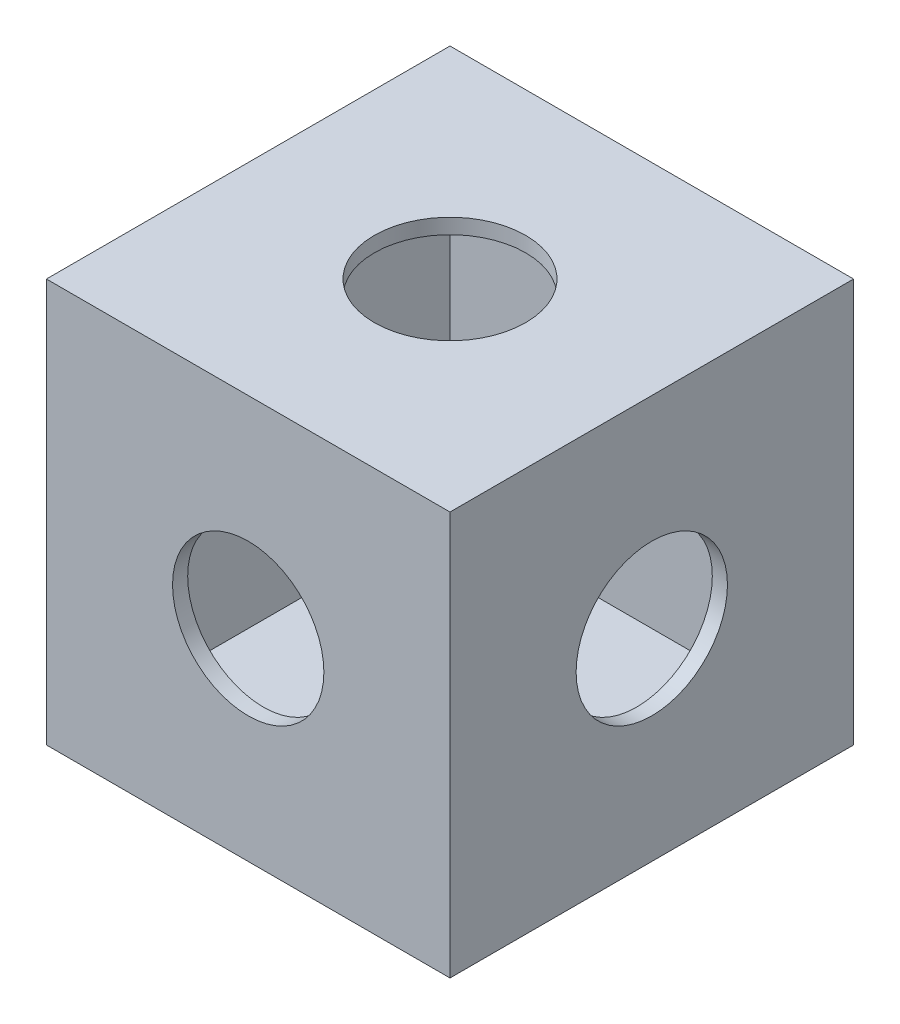
ISO-10303-21;
HEADER;
FILE_DESCRIPTION(('STEP AP214'),'2;1');
FILE_NAME('part.step','',(''),(''),'','','');
FILE_SCHEMA(('AUTOMOTIVE_DESIGN { 1 0 10303 214 1 1 1 1 }'));
ENDSEC;
DATA;
#1=APPLICATION_CONTEXT('core data for automotive mechanical design processes');
#2=APPLICATION_PROTOCOL_DEFINITION('international standard','automotive_design',2000,#1);
#3=PRODUCT_CONTEXT('',#1,'mechanical');
#4=PRODUCT('Part','Part','',(#3));
#5=PRODUCT_RELATED_PRODUCT_CATEGORY('part','',(#4));
#6=PRODUCT_DEFINITION_FORMATION('','',#4);
#7=PRODUCT_DEFINITION_CONTEXT('part definition',#1,'design');
#8=PRODUCT_DEFINITION('design','',#6,#7);
#9=PRODUCT_DEFINITION_SHAPE('','',#8);
#10=(LENGTH_UNIT() NAMED_UNIT(*) SI_UNIT(.MILLI.,.METRE.));
#11=(NAMED_UNIT(*) PLANE_ANGLE_UNIT() SI_UNIT($,.RADIAN.));
#12=(NAMED_UNIT(*) SI_UNIT($,.STERADIAN.) SOLID_ANGLE_UNIT());
#13=UNCERTAINTY_MEASURE_WITH_UNIT(LENGTH_MEASURE(1.E-05),#10,'distance_accuracy_value','');
#14=(GEOMETRIC_REPRESENTATION_CONTEXT(3) GLOBAL_UNCERTAINTY_ASSIGNED_CONTEXT((#13)) GLOBAL_UNIT_ASSIGNED_CONTEXT((#10,
#11,#12)) REPRESENTATION_CONTEXT('',''));
#15=CARTESIAN_POINT('',(0.,0.,0.));
#16=DIRECTION('',(0.,0.,1.));
#17=DIRECTION('',(1.,0.,0.));
#18=AXIS2_PLACEMENT_3D('',#15,#16,#17);
#19=CARTESIAN_POINT('',(0.,0.,0.));
#20=DIRECTION('',(0.,-1.,0.));
#21=DIRECTION('',(0.,0.,-1.));
#22=AXIS2_PLACEMENT_3D('',#19,#20,#21);
#23=PLANE('',#22);
#24=CARTESIAN_POINT('',(20.,0.,-20.));
#25=DIRECTION('',(0.,-1.,0.));
#26=DIRECTION('',(0.,0.,-1.));
#27=AXIS2_PLACEMENT_3D('',#24,#25,#26);
#28=CIRCLE('',#27,7.5);
#29=CARTESIAN_POINT('',(20.,0.,-27.5));
#30=VERTEX_POINT('',#29);
#31=EDGE_CURVE('E120',#30,#30,#28,.T.);
#32=ORIENTED_EDGE('',*,*,#31,.T.);
#33=EDGE_LOOP('',(#32));
#34=FACE_BOUND('',#33,.T.);
#35=DIRECTION('',(-1.,0.,0.));
#36=VECTOR('',#35,1.);
#37=CARTESIAN_POINT('',(1.5,0.,-38.5));
#38=LINE('',#37,#36);
#39=CARTESIAN_POINT('',(38.5,0.,-38.5));
#40=VERTEX_POINT('',#39);
#41=CARTESIAN_POINT('',(1.5,0.,-38.5));
#42=VERTEX_POINT('',#41);
#43=EDGE_CURVE('E133',#40,#42,#38,.T.);
#44=ORIENTED_EDGE('',*,*,#43,.T.);
#45=DIRECTION('',(0.,0.,1.));
#46=VECTOR('',#45,1.);
#47=CARTESIAN_POINT('',(1.5,0.,-1.5));
#48=LINE('',#47,#46);
#49=CARTESIAN_POINT('',(1.5,0.,-1.5));
#50=VERTEX_POINT('',#49);
#51=EDGE_CURVE('E128',#42,#50,#48,.T.);
#52=ORIENTED_EDGE('',*,*,#51,.T.);
#53=DIRECTION('',(1.,0.,0.));
#54=VECTOR('',#53,1.);
#55=CARTESIAN_POINT('',(1.5,0.,-1.5));
#56=LINE('',#55,#54);
#57=CARTESIAN_POINT('',(38.5,0.,-1.5));
#58=VERTEX_POINT('',#57);
#59=EDGE_CURVE('E143',#50,#58,#56,.T.);
#60=ORIENTED_EDGE('',*,*,#59,.T.);
#61=DIRECTION('',(0.,0.,-1.));
#62=VECTOR('',#61,1.);
#63=CARTESIAN_POINT('',(38.5,0.,-1.5));
#64=LINE('',#63,#62);
#65=EDGE_CURVE('E146',#58,#40,#64,.T.);
#66=ORIENTED_EDGE('',*,*,#65,.T.);
#67=EDGE_LOOP('',(#44,#52,#60,#66));
#68=FACE_BOUND('',#67,.T.);
#69=ADVANCED_FACE('F33',(#34,#68),#23,.F.);
#70=CARTESIAN_POINT('',(1.5,37.,-38.5));
#71=DIRECTION('',(0.,0.,1.));
#72=DIRECTION('',(1.,0.,0.));
#73=AXIS2_PLACEMENT_3D('',#70,#71,#72);
#74=PLANE('',#73);
#75=CARTESIAN_POINT('',(20.,18.5,-38.5));
#76=DIRECTION('',(0.,0.,1.));
#77=DIRECTION('',(1.,0.,0.));
#78=AXIS2_PLACEMENT_3D('',#75,#76,#77);
#79=CIRCLE('',#78,7.5);
#80=CARTESIAN_POINT('',(27.5,18.5,-38.5));
#81=VERTEX_POINT('',#80);
#82=EDGE_CURVE('E213',#81,#81,#79,.T.);
#83=ORIENTED_EDGE('',*,*,#82,.F.);
#84=EDGE_LOOP('',(#83));
#85=FACE_BOUND('',#84,.T.);
#86=ORIENTED_EDGE('',*,*,#43,.F.);
#87=DIRECTION('',(0.,-1.,0.));
#88=VECTOR('',#87,1.);
#89=CARTESIAN_POINT('',(38.5,37.,-38.5));
#90=LINE('',#89,#88);
#91=CARTESIAN_POINT('',(38.5,37.,-38.5));
#92=VERTEX_POINT('',#91);
#93=EDGE_CURVE('E152',#92,#40,#90,.T.);
#94=ORIENTED_EDGE('',*,*,#93,.F.);
#95=DIRECTION('',(-1.,0.,0.));
#96=VECTOR('',#95,1.);
#97=CARTESIAN_POINT('',(1.5,37.,-38.5));
#98=LINE('',#97,#96);
#99=CARTESIAN_POINT('',(1.5,37.,-38.5));
#100=VERTEX_POINT('',#99);
#101=EDGE_CURVE('E139',#92,#100,#98,.T.);
#102=ORIENTED_EDGE('',*,*,#101,.T.);
#103=DIRECTION('',(0.,-1.,0.));
#104=VECTOR('',#103,1.);
#105=CARTESIAN_POINT('',(1.5,37.,-38.5));
#106=LINE('',#105,#104);
#107=EDGE_CURVE('E50',#100,#42,#106,.T.);
#108=ORIENTED_EDGE('',*,*,#107,.T.);
#109=EDGE_LOOP('',(#86,#94,#102,#108));
#110=FACE_BOUND('',#109,.T.);
#111=ADVANCED_FACE('F191',(#85,#110),#74,.T.);
#112=CARTESIAN_POINT('',(38.5,37.,-1.5));
#113=DIRECTION('',(-1.,0.,0.));
#114=DIRECTION('',(0.,0.,1.));
#115=AXIS2_PLACEMENT_3D('',#112,#113,#114);
#116=PLANE('',#115);
#117=CARTESIAN_POINT('',(38.5,18.5,-20.));
#118=DIRECTION('',(-1.,0.,0.));
#119=DIRECTION('',(0.,0.,1.));
#120=AXIS2_PLACEMENT_3D('',#117,#118,#119);
#121=CIRCLE('',#120,7.5);
#122=CARTESIAN_POINT('',(38.5,18.5,-12.5));
#123=VERTEX_POINT('',#122);
#124=EDGE_CURVE('E224',#123,#123,#121,.T.);
#125=ORIENTED_EDGE('',*,*,#124,.F.);
#126=EDGE_LOOP('',(#125));
#127=FACE_BOUND('',#126,.T.);
#128=ORIENTED_EDGE('',*,*,#65,.F.);
#129=DIRECTION('',(0.,-1.,0.));
#130=VECTOR('',#129,1.);
#131=CARTESIAN_POINT('',(38.5,37.,-1.5));
#132=LINE('',#131,#130);
#133=CARTESIAN_POINT('',(38.5,37.,-1.5));
#134=VERTEX_POINT('',#133);
#135=EDGE_CURVE('E154',#134,#58,#132,.T.);
#136=ORIENTED_EDGE('',*,*,#135,.F.);
#137=DIRECTION('',(0.,0.,-1.));
#138=VECTOR('',#137,1.);
#139=CARTESIAN_POINT('',(38.5,37.,-1.5));
#140=LINE('',#139,#138);
#141=EDGE_CURVE('E136',#134,#92,#140,.T.);
#142=ORIENTED_EDGE('',*,*,#141,.T.);
#143=ORIENTED_EDGE('',*,*,#93,.T.);
#144=EDGE_LOOP('',(#128,#136,#142,#143));
#145=FACE_BOUND('',#144,.T.);
#146=ADVANCED_FACE('F196',(#127,#145),#116,.T.);
#147=CARTESIAN_POINT('',(1.5,37.,-1.5));
#148=DIRECTION('',(0.,0.,-1.));
#149=DIRECTION('',(-1.,0.,0.));
#150=AXIS2_PLACEMENT_3D('',#147,#148,#149);
#151=PLANE('',#150);
#152=CARTESIAN_POINT('',(20.,18.5,-1.5));
#153=DIRECTION('',(0.,0.,-1.));
#154=DIRECTION('',(-1.,0.,0.));
#155=AXIS2_PLACEMENT_3D('',#152,#153,#154);
#156=CIRCLE('',#155,7.5);
#157=CARTESIAN_POINT('',(12.5,18.5,-1.5));
#158=VERTEX_POINT('',#157);
#159=EDGE_CURVE('E219',#158,#158,#156,.T.);
#160=ORIENTED_EDGE('',*,*,#159,.F.);
#161=EDGE_LOOP('',(#160));
#162=FACE_BOUND('',#161,.T.);
#163=ORIENTED_EDGE('',*,*,#59,.F.);
#164=DIRECTION('',(0.,-1.,0.));
#165=VECTOR('',#164,1.);
#166=CARTESIAN_POINT('',(1.5,37.,-1.5));
#167=LINE('',#166,#165);
#168=CARTESIAN_POINT('',(1.5,37.,-1.5));
#169=VERTEX_POINT('',#168);
#170=EDGE_CURVE('E156',#169,#50,#167,.T.);
#171=ORIENTED_EDGE('',*,*,#170,.F.);
#172=DIRECTION('',(1.,0.,0.));
#173=VECTOR('',#172,1.);
#174=CARTESIAN_POINT('',(1.5,37.,-1.5));
#175=LINE('',#174,#173);
#176=EDGE_CURVE('E132',#169,#134,#175,.T.);
#177=ORIENTED_EDGE('',*,*,#176,.T.);
#178=ORIENTED_EDGE('',*,*,#135,.T.);
#179=EDGE_LOOP('',(#163,#171,#177,#178));
#180=FACE_BOUND('',#179,.T.);
#181=ADVANCED_FACE('F253',(#162,#180),#151,.T.);
#182=CARTESIAN_POINT('',(1.5,37.,-1.5));
#183=DIRECTION('',(1.,0.,0.));
#184=DIRECTION('',(0.,0.,-1.));
#185=AXIS2_PLACEMENT_3D('',#182,#183,#184);
#186=PLANE('',#185);
#187=CARTESIAN_POINT('',(1.5,18.5,-20.));
#188=DIRECTION('',(1.,0.,0.));
#189=DIRECTION('',(0.,0.,-1.));
#190=AXIS2_PLACEMENT_3D('',#187,#188,#189);
#191=CIRCLE('',#190,7.5);
#192=CARTESIAN_POINT('',(1.5,18.5,-27.5));
#193=VERTEX_POINT('',#192);
#194=EDGE_CURVE('E216',#193,#193,#191,.T.);
#195=ORIENTED_EDGE('',*,*,#194,.F.);
#196=EDGE_LOOP('',(#195));
#197=FACE_BOUND('',#196,.T.);
#198=ORIENTED_EDGE('',*,*,#51,.F.);
#199=ORIENTED_EDGE('',*,*,#107,.F.);
#200=DIRECTION('',(0.,0.,1.));
#201=VECTOR('',#200,1.);
#202=CARTESIAN_POINT('',(1.5,37.,-1.5));
#203=LINE('',#202,#201);
#204=EDGE_CURVE('E129',#100,#169,#203,.T.);
#205=ORIENTED_EDGE('',*,*,#204,.T.);
#206=ORIENTED_EDGE('',*,*,#170,.T.);
#207=EDGE_LOOP('',(#198,#199,#205,#206));
#208=FACE_BOUND('',#207,.T.);
#209=ADVANCED_FACE('F243',(#197,#208),#186,.T.);
#210=CARTESIAN_POINT('',(0.,37.,0.));
#211=DIRECTION('',(0.,-1.,0.));
#212=DIRECTION('',(0.,0.,-1.));
#213=AXIS2_PLACEMENT_3D('',#210,#211,#212);
#214=PLANE('',#213);
#215=CARTESIAN_POINT('',(20.,37.,-20.));
#216=DIRECTION('',(0.,-1.,0.));
#217=DIRECTION('',(0.,0.,-1.));
#218=AXIS2_PLACEMENT_3D('',#215,#216,#217);
#219=CIRCLE('',#218,7.5);
#220=CARTESIAN_POINT('',(20.,37.,-27.5));
#221=VERTEX_POINT('',#220);
#222=EDGE_CURVE('E37',#221,#221,#219,.T.);
#223=ORIENTED_EDGE('',*,*,#222,.F.);
#224=EDGE_LOOP('',(#223));
#225=FACE_BOUND('',#224,.T.);
#226=ORIENTED_EDGE('',*,*,#176,.F.);
#227=ORIENTED_EDGE('',*,*,#204,.F.);
#228=ORIENTED_EDGE('',*,*,#101,.F.);
#229=ORIENTED_EDGE('',*,*,#141,.F.);
#230=EDGE_LOOP('',(#226,#227,#228,#229));
#231=FACE_BOUND('',#230,.T.);
#232=ADVANCED_FACE('F235',(#225,#231),#214,.T.);
#233=CARTESIAN_POINT('',(20.,-1.5,-20.));
#234=DIRECTION('',(0.,1.,0.));
#235=DIRECTION('',(0.,0.,1.));
#236=AXIS2_PLACEMENT_3D('',#233,#234,#235);
#237=CYLINDRICAL_SURFACE('',#236,7.5);
#238=ORIENTED_EDGE('',*,*,#222,.T.);
#239=EDGE_LOOP('',(#238));
#240=FACE_BOUND('',#239,.T.);
#241=CARTESIAN_POINT('',(20.,38.5,-20.));
#242=DIRECTION('',(0.,1.,0.));
#243=DIRECTION('',(0.,0.,1.));
#244=AXIS2_PLACEMENT_3D('',#241,#242,#243);
#245=CIRCLE('',#244,7.5);
#246=CARTESIAN_POINT('',(20.,38.5,-12.5));
#247=VERTEX_POINT('',#246);
#248=EDGE_CURVE('E227',#247,#247,#245,.T.);
#249=ORIENTED_EDGE('',*,*,#248,.T.);
#250=EDGE_LOOP('',(#249));
#251=FACE_BOUND('',#250,.T.);
#252=ADVANCED_FACE('F232',(#240,#251),#237,.F.);
#253=CARTESIAN_POINT('',(20.,-1.5,-20.));
#254=DIRECTION('',(0.,1.,0.));
#255=DIRECTION('',(0.,0.,1.));
#256=AXIS2_PLACEMENT_3D('',#253,#254,#255);
#257=CIRCLE('',#256,7.5);
#258=CARTESIAN_POINT('',(20.,-1.5,-12.5));
#259=VERTEX_POINT('',#258);
#260=EDGE_CURVE('E228',#259,#259,#257,.T.);
#261=ORIENTED_EDGE('',*,*,#260,.F.);
#262=EDGE_LOOP('',(#261));
#263=FACE_BOUND('',#262,.T.);
#264=ORIENTED_EDGE('',*,*,#31,.F.);
#265=EDGE_LOOP('',(#264));
#266=FACE_BOUND('',#265,.T.);
#267=ADVANCED_FACE('F234',(#263,#266),#237,.F.);
#268=CARTESIAN_POINT('',(0.,-1.5,0.));
#269=DIRECTION('',(-1.,0.,0.));
#270=DIRECTION('',(0.,0.,1.));
#271=AXIS2_PLACEMENT_3D('',#268,#269,#270);
#272=PLANE('',#271);
#273=CARTESIAN_POINT('',(0.,18.5,-20.));
#274=DIRECTION('',(1.,0.,0.));
#275=DIRECTION('',(0.,0.,-1.));
#276=AXIS2_PLACEMENT_3D('',#273,#274,#275);
#277=CIRCLE('',#276,7.5);
#278=CARTESIAN_POINT('',(0.,18.5,-27.5));
#279=VERTEX_POINT('',#278);
#280=EDGE_CURVE('E212',#279,#279,#277,.T.);
#281=ORIENTED_EDGE('',*,*,#280,.T.);
#282=EDGE_LOOP('',(#281));
#283=FACE_BOUND('',#282,.T.);
#284=DIRECTION('',(0.,1.,0.));
#285=VECTOR('',#284,1.);
#286=CARTESIAN_POINT('',(0.,-1.5,0.));
#287=LINE('',#286,#285);
#288=CARTESIAN_POINT('',(0.,-1.5,0.));
#289=VERTEX_POINT('',#288);
#290=CARTESIAN_POINT('',(0.,38.5,0.));
#291=VERTEX_POINT('',#290);
#292=EDGE_CURVE('E98',#289,#291,#287,.T.);
#293=ORIENTED_EDGE('',*,*,#292,.T.);
#294=DIRECTION('',(0.,0.,1.));
#295=VECTOR('',#294,1.);
#296=CARTESIAN_POINT('',(0.,38.5,0.));
#297=LINE('',#296,#295);
#298=CARTESIAN_POINT('',(0.,38.5,-40.));
#299=VERTEX_POINT('',#298);
#300=EDGE_CURVE('E101',#299,#291,#297,.T.);
#301=ORIENTED_EDGE('',*,*,#300,.F.);
#302=DIRECTION('',(0.,1.,0.));
#303=VECTOR('',#302,1.);
#304=CARTESIAN_POINT('',(0.,-1.5,-40.));
#305=LINE('',#304,#303);
#306=CARTESIAN_POINT('',(0.,-1.5,-40.));
#307=VERTEX_POINT('',#306);
#308=EDGE_CURVE('E11',#307,#299,#305,.T.);
#309=ORIENTED_EDGE('',*,*,#308,.F.);
#310=DIRECTION('',(0.,0.,1.));
#311=VECTOR('',#310,1.);
#312=CARTESIAN_POINT('',(0.,-1.5,0.));
#313=LINE('',#312,#311);
#314=EDGE_CURVE('E102',#307,#289,#313,.T.);
#315=ORIENTED_EDGE('',*,*,#314,.T.);
#316=EDGE_LOOP('',(#293,#301,#309,#315));
#317=FACE_BOUND('',#316,.T.);
#318=ADVANCED_FACE('F35',(#283,#317),#272,.T.);
#319=CARTESIAN_POINT('',(0.,-1.5,-40.));
#320=DIRECTION('',(0.,0.,-1.));
#321=DIRECTION('',(-1.,0.,0.));
#322=AXIS2_PLACEMENT_3D('',#319,#320,#321);
#323=PLANE('',#322);
#324=CARTESIAN_POINT('',(20.,18.5,-40.));
#325=DIRECTION('',(0.,0.,1.));
#326=DIRECTION('',(1.,0.,0.));
#327=AXIS2_PLACEMENT_3D('',#324,#325,#326);
#328=CIRCLE('',#327,7.5);
#329=CARTESIAN_POINT('',(27.5,18.5,-40.));
#330=VERTEX_POINT('',#329);
#331=EDGE_CURVE('E325',#330,#330,#328,.T.);
#332=ORIENTED_EDGE('',*,*,#331,.T.);
#333=EDGE_LOOP('',(#332));
#334=FACE_BOUND('',#333,.T.);
#335=ORIENTED_EDGE('',*,*,#308,.T.);
#336=DIRECTION('',(-1.,0.,0.));
#337=VECTOR('',#336,1.);
#338=CARTESIAN_POINT('',(0.,38.5,-40.));
#339=LINE('',#338,#337);
#340=CARTESIAN_POINT('',(40.,38.5,-40.));
#341=VERTEX_POINT('',#340);
#342=EDGE_CURVE('E119',#341,#299,#339,.T.);
#343=ORIENTED_EDGE('',*,*,#342,.F.);
#344=DIRECTION('',(0.,1.,0.));
#345=VECTOR('',#344,1.);
#346=CARTESIAN_POINT('',(40.,-1.5,-40.));
#347=LINE('',#346,#345);
#348=CARTESIAN_POINT('',(40.,-1.5,-40.));
#349=VERTEX_POINT('',#348);
#350=EDGE_CURVE('E42',#349,#341,#347,.T.);
#351=ORIENTED_EDGE('',*,*,#350,.F.);
#352=DIRECTION('',(-1.,0.,0.));
#353=VECTOR('',#352,1.);
#354=CARTESIAN_POINT('',(0.,-1.5,-40.));
#355=LINE('',#354,#353);
#356=EDGE_CURVE('E107',#349,#307,#355,.T.);
#357=ORIENTED_EDGE('',*,*,#356,.T.);
#358=EDGE_LOOP('',(#335,#343,#351,#357));
#359=FACE_BOUND('',#358,.T.);
#360=ADVANCED_FACE('F173',(#334,#359),#323,.T.);
#361=CARTESIAN_POINT('',(40.,-1.5,0.));
#362=DIRECTION('',(1.,0.,0.));
#363=DIRECTION('',(0.,0.,-1.));
#364=AXIS2_PLACEMENT_3D('',#361,#362,#363);
#365=PLANE('',#364);
#366=CARTESIAN_POINT('',(40.,18.5,-20.));
#367=DIRECTION('',(1.,0.,0.));
#368=DIRECTION('',(0.,0.,-1.));
#369=AXIS2_PLACEMENT_3D('',#366,#367,#368);
#370=CIRCLE('',#369,7.5);
#371=CARTESIAN_POINT('',(40.,18.5,-27.5));
#372=VERTEX_POINT('',#371);
#373=EDGE_CURVE('E210',#372,#372,#370,.T.);
#374=ORIENTED_EDGE('',*,*,#373,.F.);
#375=EDGE_LOOP('',(#374));
#376=FACE_BOUND('',#375,.T.);
#377=ORIENTED_EDGE('',*,*,#350,.T.);
#378=DIRECTION('',(0.,0.,-1.));
#379=VECTOR('',#378,1.);
#380=CARTESIAN_POINT('',(40.,38.5,0.));
#381=LINE('',#380,#379);
#382=CARTESIAN_POINT('',(40.,38.5,0.));
#383=VERTEX_POINT('',#382);
#384=EDGE_CURVE('E114',#383,#341,#381,.T.);
#385=ORIENTED_EDGE('',*,*,#384,.F.);
#386=DIRECTION('',(0.,1.,0.));
#387=VECTOR('',#386,1.);
#388=CARTESIAN_POINT('',(40.,-1.5,0.));
#389=LINE('',#388,#387);
#390=CARTESIAN_POINT('',(40.,-1.5,0.));
#391=VERTEX_POINT('',#390);
#392=EDGE_CURVE('E106',#391,#383,#389,.T.);
#393=ORIENTED_EDGE('',*,*,#392,.F.);
#394=DIRECTION('',(0.,0.,-1.));
#395=VECTOR('',#394,1.);
#396=CARTESIAN_POINT('',(40.,-1.5,0.));
#397=LINE('',#396,#395);
#398=EDGE_CURVE('E162',#391,#349,#397,.T.);
#399=ORIENTED_EDGE('',*,*,#398,.T.);
#400=EDGE_LOOP('',(#377,#385,#393,#399));
#401=FACE_BOUND('',#400,.T.);
#402=ADVANCED_FACE('F169',(#376,#401),#365,.T.);
#403=CARTESIAN_POINT('',(0.,-1.5,0.));
#404=DIRECTION('',(0.,0.,1.));
#405=DIRECTION('',(1.,0.,0.));
#406=AXIS2_PLACEMENT_3D('',#403,#404,#405);
#407=PLANE('',#406);
#408=CARTESIAN_POINT('',(20.,18.5,0.));
#409=DIRECTION('',(0.,0.,1.));
#410=DIRECTION('',(1.,0.,0.));
#411=AXIS2_PLACEMENT_3D('',#408,#409,#410);
#412=CIRCLE('',#411,7.5);
#413=CARTESIAN_POINT('',(27.5,18.5,0.));
#414=VERTEX_POINT('',#413);
#415=EDGE_CURVE('E326',#414,#414,#412,.T.);
#416=ORIENTED_EDGE('',*,*,#415,.F.);
#417=EDGE_LOOP('',(#416));
#418=FACE_BOUND('',#417,.T.);
#419=ORIENTED_EDGE('',*,*,#392,.T.);
#420=DIRECTION('',(1.,0.,0.));
#421=VECTOR('',#420,1.);
#422=CARTESIAN_POINT('',(0.,38.5,0.));
#423=LINE('',#422,#421);
#424=EDGE_CURVE('E109',#291,#383,#423,.T.);
#425=ORIENTED_EDGE('',*,*,#424,.F.);
#426=ORIENTED_EDGE('',*,*,#292,.F.);
#427=DIRECTION('',(1.,0.,0.));
#428=VECTOR('',#427,1.);
#429=CARTESIAN_POINT('',(0.,-1.5,0.));
#430=LINE('',#429,#428);
#431=EDGE_CURVE('E160',#289,#391,#430,.T.);
#432=ORIENTED_EDGE('',*,*,#431,.T.);
#433=EDGE_LOOP('',(#419,#425,#426,#432));
#434=FACE_BOUND('',#433,.T.);
#435=ADVANCED_FACE('F110',(#418,#434),#407,.T.);
#436=CARTESIAN_POINT('',(0.,-1.5,0.));
#437=DIRECTION('',(0.,-1.,0.));
#438=DIRECTION('',(0.,0.,-1.));
#439=AXIS2_PLACEMENT_3D('',#436,#437,#438);
#440=PLANE('',#439);
#441=ORIENTED_EDGE('',*,*,#260,.T.);
#442=EDGE_LOOP('',(#441));
#443=FACE_BOUND('',#442,.T.);
#444=ORIENTED_EDGE('',*,*,#314,.F.);
#445=ORIENTED_EDGE('',*,*,#356,.F.);
#446=ORIENTED_EDGE('',*,*,#398,.F.);
#447=ORIENTED_EDGE('',*,*,#431,.F.);
#448=EDGE_LOOP('',(#444,#445,#446,#447));
#449=FACE_BOUND('',#448,.T.);
#450=ADVANCED_FACE('F175',(#443,#449),#440,.T.);
#451=CARTESIAN_POINT('',(0.,38.5,0.));
#452=DIRECTION('',(0.,-1.,0.));
#453=DIRECTION('',(0.,0.,-1.));
#454=AXIS2_PLACEMENT_3D('',#451,#452,#453);
#455=PLANE('',#454);
#456=ORIENTED_EDGE('',*,*,#248,.F.);
#457=EDGE_LOOP('',(#456));
#458=FACE_BOUND('',#457,.T.);
#459=ORIENTED_EDGE('',*,*,#300,.T.);
#460=ORIENTED_EDGE('',*,*,#424,.T.);
#461=ORIENTED_EDGE('',*,*,#384,.T.);
#462=ORIENTED_EDGE('',*,*,#342,.T.);
#463=EDGE_LOOP('',(#459,#460,#461,#462));
#464=FACE_BOUND('',#463,.T.);
#465=ADVANCED_FACE('F117',(#458,#464),#455,.F.);
#466=CARTESIAN_POINT('',(0.,18.5,-20.));
#467=DIRECTION('',(1.,0.,0.));
#468=DIRECTION('',(0.,0.,-1.));
#469=AXIS2_PLACEMENT_3D('',#466,#467,#468);
#470=CYLINDRICAL_SURFACE('',#469,7.5);
#471=ORIENTED_EDGE('',*,*,#124,.T.);
#472=EDGE_LOOP('',(#471));
#473=FACE_BOUND('',#472,.T.);
#474=ORIENTED_EDGE('',*,*,#373,.T.);
#475=EDGE_LOOP('',(#474));
#476=FACE_BOUND('',#475,.T.);
#477=ADVANCED_FACE('F183',(#473,#476),#470,.F.);
#478=ORIENTED_EDGE('',*,*,#194,.T.);
#479=EDGE_LOOP('',(#478));
#480=FACE_BOUND('',#479,.T.);
#481=ORIENTED_EDGE('',*,*,#280,.F.);
#482=EDGE_LOOP('',(#481));
#483=FACE_BOUND('',#482,.T.);
#484=ADVANCED_FACE('F248',(#480,#483),#470,.F.);
#485=CARTESIAN_POINT('',(20.,18.5,-40.));
#486=DIRECTION('',(0.,0.,1.));
#487=DIRECTION('',(1.,0.,0.));
#488=AXIS2_PLACEMENT_3D('',#485,#486,#487);
#489=CYLINDRICAL_SURFACE('',#488,7.5);
#490=ORIENTED_EDGE('',*,*,#159,.T.);
#491=EDGE_LOOP('',(#490));
#492=FACE_BOUND('',#491,.T.);
#493=ORIENTED_EDGE('',*,*,#415,.T.);
#494=EDGE_LOOP('',(#493));
#495=FACE_BOUND('',#494,.T.);
#496=ADVANCED_FACE('F273',(#492,#495),#489,.F.);
#497=ORIENTED_EDGE('',*,*,#82,.T.);
#498=EDGE_LOOP('',(#497));
#499=FACE_BOUND('',#498,.T.);
#500=ORIENTED_EDGE('',*,*,#331,.F.);
#501=EDGE_LOOP('',(#500));
#502=FACE_BOUND('',#501,.T.);
#503=ADVANCED_FACE('F308',(#499,#502),#489,.F.);
#504=CLOSED_SHELL('',(#69,#111,#146,#181,#209,#232,#252,#267,#318,#360,#402,#435,#450,#465,#477,
#484,#496,#503));
#505=MANIFOLD_SOLID_BREP('B2',#504);
#506=ADVANCED_BREP_SHAPE_REPRESENTATION('',(#18,#505),#14);
#507=SHAPE_DEFINITION_REPRESENTATION(#9,#506);
ENDSEC;
END-ISO-10303-21;
